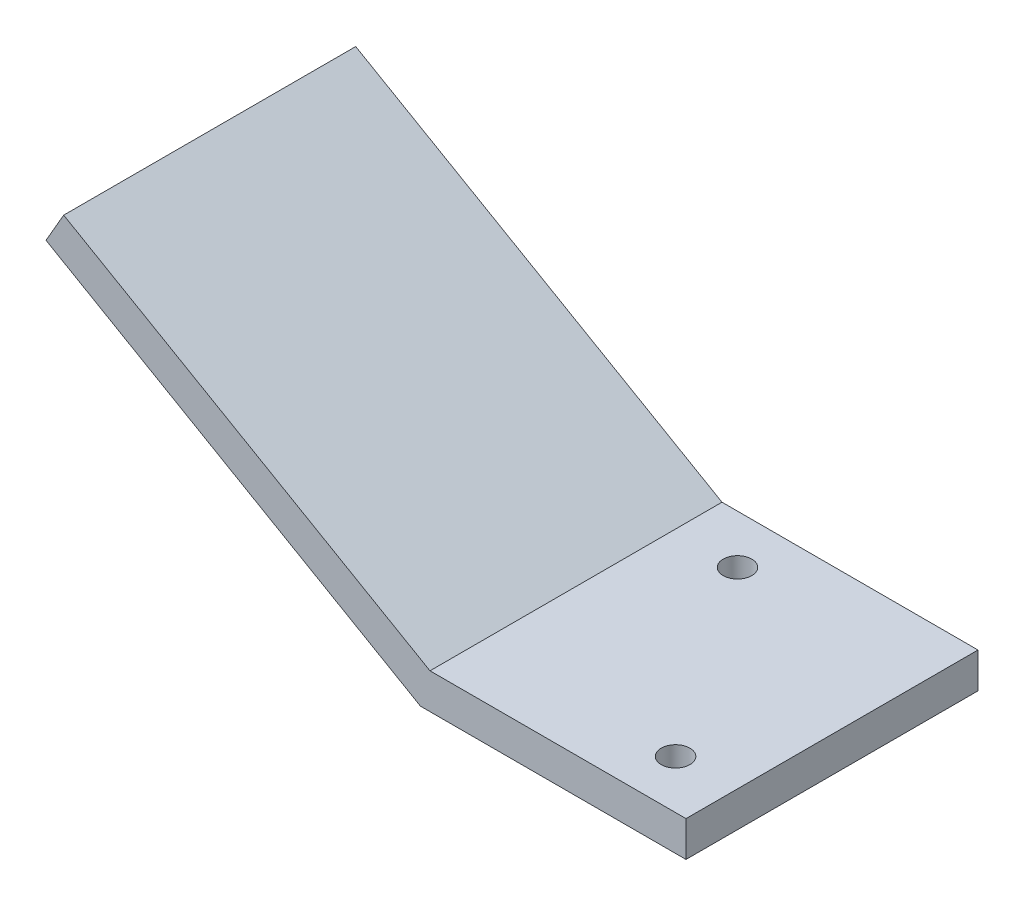
ISO-10303-21;
HEADER;
FILE_DESCRIPTION(('STEP AP214'),'2;1');
FILE_NAME('part.step','',(''),(''),'','','');
FILE_SCHEMA(('AUTOMOTIVE_DESIGN { 1 0 10303 214 1 1 1 1 }'));
ENDSEC;
DATA;
#1=APPLICATION_CONTEXT('core data for automotive mechanical design processes');
#2=APPLICATION_PROTOCOL_DEFINITION('international standard','automotive_design',2000,#1);
#3=PRODUCT_CONTEXT('',#1,'mechanical');
#4=PRODUCT('Part','Part','',(#3));
#5=PRODUCT_RELATED_PRODUCT_CATEGORY('part','',(#4));
#6=PRODUCT_DEFINITION_FORMATION('','',#4);
#7=PRODUCT_DEFINITION_CONTEXT('part definition',#1,'design');
#8=PRODUCT_DEFINITION('design','',#6,#7);
#9=PRODUCT_DEFINITION_SHAPE('','',#8);
#10=(LENGTH_UNIT() NAMED_UNIT(*) SI_UNIT(.MILLI.,.METRE.));
#11=(NAMED_UNIT(*) PLANE_ANGLE_UNIT() SI_UNIT($,.RADIAN.));
#12=(NAMED_UNIT(*) SI_UNIT($,.STERADIAN.) SOLID_ANGLE_UNIT());
#13=UNCERTAINTY_MEASURE_WITH_UNIT(LENGTH_MEASURE(1.E-05),#10,'distance_accuracy_value','');
#14=(GEOMETRIC_REPRESENTATION_CONTEXT(3) GLOBAL_UNCERTAINTY_ASSIGNED_CONTEXT((#13)) GLOBAL_UNIT_ASSIGNED_CONTEXT((#10,
#11,#12)) REPRESENTATION_CONTEXT('',''));
#15=CARTESIAN_POINT('',(0.,0.,0.));
#16=DIRECTION('',(0.,0.,1.));
#17=DIRECTION('',(1.,0.,0.));
#18=AXIS2_PLACEMENT_3D('',#15,#16,#17);
#19=CARTESIAN_POINT('',(-13.6602540378444,-3.66025403784447,0.));
#20=DIRECTION('',(0.,0.,-1.));
#21=DIRECTION('',(-1.,0.,0.));
#22=AXIS2_PLACEMENT_3D('',#19,#20,#21);
#23=PLANE('',#22);
#24=DIRECTION('',(-0.866025403784442,0.499999999999995,0.));
#25=VECTOR('',#24,1.);
#26=CARTESIAN_POINT('',(-11.6602540378444,-0.196152422706703,0.));
#27=LINE('',#26,#25);
#28=CARTESIAN_POINT('',(-11.6602540378444,-0.196152422706704,0.));
#29=VERTEX_POINT('',#28);
#30=CARTESIAN_POINT('',(-37.6410161513776,14.8038475772931,0.));
#31=VERTEX_POINT('',#30);
#32=EDGE_CURVE('E204',#29,#31,#27,.T.);
#33=ORIENTED_EDGE('',*,*,#32,.F.);
#34=DIRECTION('',(0.499999999999995,0.866025403784442,0.));
#35=VECTOR('',#34,1.);
#36=CARTESIAN_POINT('',(-13.6602540378444,-3.66025403784447,0.));
#37=LINE('',#36,#35);
#38=CARTESIAN_POINT('',(-8.66025403784442,4.99999999999995,0.));
#39=VERTEX_POINT('',#38);
#40=EDGE_CURVE('E211',#29,#39,#37,.T.);
#41=ORIENTED_EDGE('',*,*,#40,.T.);
#42=DIRECTION('',(-0.866025403784442,0.499999999999995,0.));
#43=VECTOR('',#42,1.);
#44=CARTESIAN_POINT('',(-8.66025403784442,4.99999999999995,0.));
#45=LINE('',#44,#43);
#46=CARTESIAN_POINT('',(-34.6410161513777,19.9999999999998,0.));
#47=VERTEX_POINT('',#46);
#48=EDGE_CURVE('E206',#39,#47,#45,.T.);
#49=ORIENTED_EDGE('',*,*,#48,.T.);
#50=DIRECTION('',(0.499999999999995,0.866025403784442,0.));
#51=VECTOR('',#50,1.);
#52=CARTESIAN_POINT('',(-39.6410161513776,11.3397459621554,0.));
#53=LINE('',#52,#51);
#54=EDGE_CURVE('E224',#31,#47,#53,.T.);
#55=ORIENTED_EDGE('',*,*,#54,.F.);
#56=EDGE_LOOP('',(#33,#41,#49,#55));
#57=FACE_BOUND('',#56,.T.);
#58=ADVANCED_FACE('F58',(#57),#23,.F.);
#59=CARTESIAN_POINT('',(-13.6602540378444,-3.66025403784447,-9.99999999999999));
#60=DIRECTION('',(0.,0.,1.));
#61=DIRECTION('',(1.,0.,0.));
#62=AXIS2_PLACEMENT_3D('',#59,#60,#61);
#63=PLANE('',#62);
#64=DIRECTION('',(0.866025403784442,-0.499999999999995,0.));
#65=VECTOR('',#64,1.);
#66=CARTESIAN_POINT('',(-11.6602540378444,-0.196152422706703,-9.99999999999999));
#67=LINE('',#66,#65);
#68=CARTESIAN_POINT('',(-37.6410161513776,14.8038475772931,-9.99999999999999));
#69=VERTEX_POINT('',#68);
#70=CARTESIAN_POINT('',(-11.6602540378444,-0.196152422706704,-9.99999999999999));
#71=VERTEX_POINT('',#70);
#72=EDGE_CURVE('E178',#69,#71,#67,.T.);
#73=ORIENTED_EDGE('',*,*,#72,.F.);
#74=DIRECTION('',(0.499999999999995,0.866025403784442,0.));
#75=VECTOR('',#74,1.);
#76=CARTESIAN_POINT('',(-39.6410161513776,11.3397459621554,-9.99999999999999));
#77=LINE('',#76,#75);
#78=CARTESIAN_POINT('',(-34.6410161513777,19.9999999999998,-9.99999999999999));
#79=VERTEX_POINT('',#78);
#80=EDGE_CURVE('E222',#69,#79,#77,.T.);
#81=ORIENTED_EDGE('',*,*,#80,.T.);
#82=DIRECTION('',(0.866025403784442,-0.499999999999995,0.));
#83=VECTOR('',#82,1.);
#84=CARTESIAN_POINT('',(-8.66025403784442,4.99999999999995,-9.99999999999999));
#85=LINE('',#84,#83);
#86=CARTESIAN_POINT('',(-8.66025403784442,4.99999999999995,-9.99999999999999));
#87=VERTEX_POINT('',#86);
#88=EDGE_CURVE('E217',#79,#87,#85,.T.);
#89=ORIENTED_EDGE('',*,*,#88,.T.);
#90=DIRECTION('',(0.499999999999995,0.866025403784442,0.));
#91=VECTOR('',#90,1.);
#92=CARTESIAN_POINT('',(-13.6602540378444,-3.66025403784447,-9.99999999999999));
#93=LINE('',#92,#91);
#94=EDGE_CURVE('E75',#71,#87,#93,.T.);
#95=ORIENTED_EDGE('',*,*,#94,.F.);
#96=EDGE_LOOP('',(#73,#81,#89,#95));
#97=FACE_BOUND('',#96,.T.);
#98=ADVANCED_FACE('F314',(#97),#63,.F.);
#99=CARTESIAN_POINT('',(0.,0.,-18.5));
#100=DIRECTION('',(-0.499999999999995,-0.866025403784442,0.));
#101=DIRECTION('',(0.866025403784442,-0.499999999999995,0.));
#102=AXIS2_PLACEMENT_3D('',#99,#100,#101);
#103=PLANE('',#102);
#104=DIRECTION('',(0.,0.,1.));
#105=VECTOR('',#104,1.);
#106=CARTESIAN_POINT('',(-42.3205080756888,24.4337567297404,11.5));
#107=LINE('',#106,#105);
#108=CARTESIAN_POINT('',(-42.3205080756888,24.4337567297404,-21.5));
#109=VERTEX_POINT('',#108);
#110=CARTESIAN_POINT('',(-42.3205080756888,24.4337567297404,11.5));
#111=VERTEX_POINT('',#110);
#112=EDGE_CURVE('E259',#109,#111,#107,.T.);
#113=ORIENTED_EDGE('',*,*,#112,.F.);
#114=DIRECTION('',(-0.866025403784441,0.499999999999996,0.));
#115=VECTOR('',#114,1.);
#116=CARTESIAN_POINT('',(-42.3205080756888,24.4337567297404,-21.5));
#117=LINE('',#116,#115);
#118=CARTESIAN_POINT('',(0.,0.,-21.5));
#119=VERTEX_POINT('',#118);
#120=EDGE_CURVE('E248',#119,#109,#117,.T.);
#121=ORIENTED_EDGE('',*,*,#120,.F.);
#122=DIRECTION('',(0.,0.,1.));
#123=VECTOR('',#122,1.);
#124=CARTESIAN_POINT('',(0.,0.,0.));
#125=LINE('',#124,#123);
#126=CARTESIAN_POINT('',(0.,0.,11.5));
#127=VERTEX_POINT('',#126);
#128=EDGE_CURVE('E12',#119,#127,#125,.T.);
#129=ORIENTED_EDGE('',*,*,#128,.T.);
#130=DIRECTION('',(0.866025403784442,-0.499999999999995,0.));
#131=VECTOR('',#130,1.);
#132=CARTESIAN_POINT('',(0.,0.,11.5));
#133=LINE('',#132,#131);
#134=EDGE_CURVE('E267',#111,#127,#133,.T.);
#135=ORIENTED_EDGE('',*,*,#134,.F.);
#136=EDGE_LOOP('',(#113,#121,#129,#135));
#137=FACE_BOUND('',#136,.T.);
#138=DIRECTION('',(0.,0.,-1.));
#139=VECTOR('',#138,1.);
#140=CARTESIAN_POINT('',(-34.6410161513777,19.9999999999998,0.));
#141=LINE('',#140,#139);
#142=EDGE_CURVE('E214',#47,#79,#141,.T.);
#143=ORIENTED_EDGE('',*,*,#142,.F.);
#144=ORIENTED_EDGE('',*,*,#48,.F.);
#145=DIRECTION('',(0.,0.,1.));
#146=VECTOR('',#145,1.);
#147=CARTESIAN_POINT('',(-8.66025403784442,4.99999999999995,-9.99999999999999));
#148=LINE('',#147,#146);
#149=EDGE_CURVE('E209',#87,#39,#148,.T.);
#150=ORIENTED_EDGE('',*,*,#149,.F.);
#151=ORIENTED_EDGE('',*,*,#88,.F.);
#152=EDGE_LOOP('',(#143,#144,#150,#151));
#153=FACE_BOUND('',#152,.T.);
#154=ADVANCED_FACE('F311',(#137,#153),#103,.T.);
#155=CARTESIAN_POINT('',(-25.,20.,11.5));
#156=DIRECTION('',(0.,0.,-1.));
#157=DIRECTION('',(-1.,0.,0.));
#158=AXIS2_PLACEMENT_3D('',#155,#156,#157);
#159=PLANE('',#158);
#160=DIRECTION('',(-0.866025403784438,0.500000000000001,0.));
#161=VECTOR('',#160,1.);
#162=CARTESIAN_POINT('',(1.99999999999989,3.46410161513756,11.5));
#163=LINE('',#162,#161);
#164=CARTESIAN_POINT('',(1.07179676972404,4.,11.5));
#165=VERTEX_POINT('',#164);
#166=CARTESIAN_POINT('',(-40.3205080756889,27.897858344878,11.5));
#167=VERTEX_POINT('',#166);
#168=EDGE_CURVE('E83',#165,#167,#163,.T.);
#169=ORIENTED_EDGE('',*,*,#168,.T.);
#170=DIRECTION('',(0.499999999999997,0.866025403784441,0.));
#171=VECTOR('',#170,1.);
#172=CARTESIAN_POINT('',(-40.3205080756889,27.897858344878,11.5));
#173=LINE('',#172,#171);
#174=EDGE_CURVE('E262',#111,#167,#173,.T.);
#175=ORIENTED_EDGE('',*,*,#174,.F.);
#176=ORIENTED_EDGE('',*,*,#134,.T.);
#177=DIRECTION('',(1.,0.,0.));
#178=VECTOR('',#177,1.);
#179=CARTESIAN_POINT('',(-25.,0.,11.5));
#180=LINE('',#179,#178);
#181=CARTESIAN_POINT('',(30.,0.,11.5));
#182=VERTEX_POINT('',#181);
#183=EDGE_CURVE('E67',#127,#182,#180,.T.);
#184=ORIENTED_EDGE('',*,*,#183,.T.);
#185=DIRECTION('',(0.,-1.,0.));
#186=VECTOR('',#185,1.);
#187=CARTESIAN_POINT('',(30.,0.,11.5));
#188=LINE('',#187,#186);
#189=CARTESIAN_POINT('',(30.,4.,11.5));
#190=VERTEX_POINT('',#189);
#191=EDGE_CURVE('E233',#190,#182,#188,.T.);
#192=ORIENTED_EDGE('',*,*,#191,.F.);
#193=DIRECTION('',(-1.,0.,0.));
#194=VECTOR('',#193,1.);
#195=CARTESIAN_POINT('',(0.,4.,11.5));
#196=LINE('',#195,#194);
#197=EDGE_CURVE('E271',#190,#165,#196,.T.);
#198=ORIENTED_EDGE('',*,*,#197,.T.);
#199=EDGE_LOOP('',(#169,#175,#176,#184,#192,#198));
#200=FACE_BOUND('',#199,.T.);
#201=ADVANCED_FACE('F60',(#200),#159,.F.);
#202=CARTESIAN_POINT('',(0.,0.,0.));
#203=DIRECTION('',(0.,1.,0.));
#204=DIRECTION('',(0.,0.,1.));
#205=AXIS2_PLACEMENT_3D('',#202,#203,#204);
#206=PLANE('',#205);
#207=CARTESIAN_POINT('',(23.3222354943985,0.,6.));
#208=DIRECTION('',(0.,-1.,0.));
#209=DIRECTION('',(0.,0.,-1.));
#210=AXIS2_PLACEMENT_3D('',#207,#208,#209);
#211=CIRCLE('',#210,1.62);
#212=CARTESIAN_POINT('',(23.3222354943985,0.,4.38));
#213=VERTEX_POINT('',#212);
#214=EDGE_CURVE('E227',#213,#213,#211,.T.);
#215=ORIENTED_EDGE('',*,*,#214,.F.);
#216=EDGE_LOOP('',(#215));
#217=FACE_BOUND('',#216,.T.);
#218=CARTESIAN_POINT('',(8.3222354943985,0.,-16.));
#219=DIRECTION('',(0.,-1.,0.));
#220=DIRECTION('',(0.,0.,-1.));
#221=AXIS2_PLACEMENT_3D('',#218,#219,#220);
#222=CIRCLE('',#221,1.62);
#223=CARTESIAN_POINT('',(8.3222354943985,0.,-17.62));
#224=VERTEX_POINT('',#223);
#225=EDGE_CURVE('E226',#224,#224,#222,.T.);
#226=ORIENTED_EDGE('',*,*,#225,.F.);
#227=EDGE_LOOP('',(#226));
#228=FACE_BOUND('',#227,.T.);
#229=ORIENTED_EDGE('',*,*,#128,.F.);
#230=DIRECTION('',(-1.,0.,0.));
#231=VECTOR('',#230,1.);
#232=CARTESIAN_POINT('',(0.,0.,-21.5));
#233=LINE('',#232,#231);
#234=CARTESIAN_POINT('',(30.,0.,-21.5));
#235=VERTEX_POINT('',#234);
#236=EDGE_CURVE('E245',#235,#119,#233,.T.);
#237=ORIENTED_EDGE('',*,*,#236,.F.);
#238=DIRECTION('',(0.,0.,-1.));
#239=VECTOR('',#238,1.);
#240=CARTESIAN_POINT('',(30.,0.,-21.5));
#241=LINE('',#240,#239);
#242=EDGE_CURVE('E236',#182,#235,#241,.T.);
#243=ORIENTED_EDGE('',*,*,#242,.F.);
#244=ORIENTED_EDGE('',*,*,#183,.F.);
#245=EDGE_LOOP('',(#229,#237,#243,#244));
#246=FACE_BOUND('',#245,.T.);
#247=ADVANCED_FACE('F303',(#217,#228,#246),#206,.F.);
#248=CARTESIAN_POINT('',(1.99999999999989,3.46410161513756,-18.5));
#249=DIRECTION('',(0.500000000000001,0.866025403784438,0.));
#250=DIRECTION('',(-0.866025403784438,0.500000000000001,0.));
#251=AXIS2_PLACEMENT_3D('',#248,#249,#250);
#252=PLANE('',#251);
#253=DIRECTION('',(0.,0.,1.));
#254=VECTOR('',#253,1.);
#255=CARTESIAN_POINT('',(1.07179676972404,4.,-18.5));
#256=LINE('',#255,#254);
#257=CARTESIAN_POINT('',(1.07179676972404,4.,-21.5));
#258=VERTEX_POINT('',#257);
#259=EDGE_CURVE('E274',#258,#165,#256,.T.);
#260=ORIENTED_EDGE('',*,*,#259,.F.);
#261=DIRECTION('',(0.866025403784439,-0.499999999999999,0.));
#262=VECTOR('',#261,1.);
#263=CARTESIAN_POINT('',(1.07179676972404,4.,-21.5));
#264=LINE('',#263,#262);
#265=CARTESIAN_POINT('',(-40.3205080756888,27.8978583448781,-21.5));
#266=VERTEX_POINT('',#265);
#267=EDGE_CURVE('E254',#266,#258,#264,.T.);
#268=ORIENTED_EDGE('',*,*,#267,.F.);
#269=DIRECTION('',(0.,0.,-1.));
#270=VECTOR('',#269,1.);
#271=CARTESIAN_POINT('',(-40.3205080756888,27.8978583448781,-11.5));
#272=LINE('',#271,#270);
#273=EDGE_CURVE('E265',#167,#266,#272,.T.);
#274=ORIENTED_EDGE('',*,*,#273,.F.);
#275=ORIENTED_EDGE('',*,*,#168,.F.);
#276=EDGE_LOOP('',(#260,#268,#274,#275));
#277=FACE_BOUND('',#276,.T.);
#278=ADVANCED_FACE('F289',(#277),#252,.T.);
#279=CARTESIAN_POINT('',(0.,4.,-18.5));
#280=DIRECTION('',(0.,1.,0.));
#281=DIRECTION('',(0.,0.,1.));
#282=AXIS2_PLACEMENT_3D('',#279,#280,#281);
#283=PLANE('',#282);
#284=CARTESIAN_POINT('',(23.3222354943985,4.,6.));
#285=DIRECTION('',(0.,1.,0.));
#286=DIRECTION('',(0.,0.,1.));
#287=AXIS2_PLACEMENT_3D('',#284,#285,#286);
#288=CIRCLE('',#287,1.62);
#289=CARTESIAN_POINT('',(23.3222354943985,4.,7.62));
#290=VERTEX_POINT('',#289);
#291=EDGE_CURVE('E62',#290,#290,#288,.T.);
#292=ORIENTED_EDGE('',*,*,#291,.F.);
#293=EDGE_LOOP('',(#292));
#294=FACE_BOUND('',#293,.T.);
#295=CARTESIAN_POINT('',(8.3222354943985,4.,-16.));
#296=DIRECTION('',(0.,1.,0.));
#297=DIRECTION('',(0.,0.,1.));
#298=AXIS2_PLACEMENT_3D('',#295,#296,#297);
#299=CIRCLE('',#298,1.62);
#300=CARTESIAN_POINT('',(8.3222354943985,4.,-14.38));
#301=VERTEX_POINT('',#300);
#302=EDGE_CURVE('E230',#301,#301,#299,.T.);
#303=ORIENTED_EDGE('',*,*,#302,.F.);
#304=EDGE_LOOP('',(#303));
#305=FACE_BOUND('',#304,.T.);
#306=ORIENTED_EDGE('',*,*,#197,.F.);
#307=DIRECTION('',(0.,0.,1.));
#308=VECTOR('',#307,1.);
#309=CARTESIAN_POINT('',(30.,4.,11.5));
#310=LINE('',#309,#308);
#311=CARTESIAN_POINT('',(30.,4.,-21.5));
#312=VERTEX_POINT('',#311);
#313=EDGE_CURVE('E242',#312,#190,#310,.T.);
#314=ORIENTED_EDGE('',*,*,#313,.F.);
#315=DIRECTION('',(1.,0.,0.));
#316=VECTOR('',#315,1.);
#317=CARTESIAN_POINT('',(25.,4.,-21.5));
#318=LINE('',#317,#316);
#319=EDGE_CURVE('E257',#258,#312,#318,.T.);
#320=ORIENTED_EDGE('',*,*,#319,.F.);
#321=ORIENTED_EDGE('',*,*,#259,.T.);
#322=EDGE_LOOP('',(#306,#314,#320,#321));
#323=FACE_BOUND('',#322,.T.);
#324=ADVANCED_FACE('F285',(#294,#305,#323),#283,.T.);
#325=CARTESIAN_POINT('',(-42.3205080756888,24.4337567297404,0.));
#326=DIRECTION('',(0.86602540378444,-0.499999999999997,0.));
#327=DIRECTION('',(0.499999999999997,0.86602540378444,0.));
#328=AXIS2_PLACEMENT_3D('',#325,#326,#327);
#329=PLANE('',#328);
#330=ORIENTED_EDGE('',*,*,#273,.T.);
#331=DIRECTION('',(0.499999999999997,0.86602540378444,0.));
#332=VECTOR('',#331,1.);
#333=CARTESIAN_POINT('',(-40.3205080756888,27.8978583448781,-21.5));
#334=LINE('',#333,#332);
#335=EDGE_CURVE('E251',#109,#266,#334,.T.);
#336=ORIENTED_EDGE('',*,*,#335,.F.);
#337=ORIENTED_EDGE('',*,*,#112,.T.);
#338=ORIENTED_EDGE('',*,*,#174,.T.);
#339=EDGE_LOOP('',(#330,#336,#337,#338));
#340=FACE_BOUND('',#339,.T.);
#341=ADVANCED_FACE('F288',(#340),#329,.F.);
#342=CARTESIAN_POINT('',(0.,0.,-21.5));
#343=DIRECTION('',(0.,0.,1.));
#344=DIRECTION('',(1.,0.,0.));
#345=AXIS2_PLACEMENT_3D('',#342,#343,#344);
#346=PLANE('',#345);
#347=ORIENTED_EDGE('',*,*,#319,.T.);
#348=DIRECTION('',(0.,1.,0.));
#349=VECTOR('',#348,1.);
#350=CARTESIAN_POINT('',(30.,4.,-21.5));
#351=LINE('',#350,#349);
#352=EDGE_CURVE('E239',#235,#312,#351,.T.);
#353=ORIENTED_EDGE('',*,*,#352,.F.);
#354=ORIENTED_EDGE('',*,*,#236,.T.);
#355=ORIENTED_EDGE('',*,*,#120,.T.);
#356=ORIENTED_EDGE('',*,*,#335,.T.);
#357=ORIENTED_EDGE('',*,*,#267,.T.);
#358=EDGE_LOOP('',(#347,#353,#354,#355,#356,#357));
#359=FACE_BOUND('',#358,.T.);
#360=ADVANCED_FACE('F305',(#359),#346,.F.);
#361=CARTESIAN_POINT('',(30.,0.,0.));
#362=DIRECTION('',(-1.,0.,0.));
#363=DIRECTION('',(0.,0.,1.));
#364=AXIS2_PLACEMENT_3D('',#361,#362,#363);
#365=PLANE('',#364);
#366=ORIENTED_EDGE('',*,*,#191,.T.);
#367=ORIENTED_EDGE('',*,*,#242,.T.);
#368=ORIENTED_EDGE('',*,*,#352,.T.);
#369=ORIENTED_EDGE('',*,*,#313,.T.);
#370=EDGE_LOOP('',(#366,#367,#368,#369));
#371=FACE_BOUND('',#370,.T.);
#372=ADVANCED_FACE('F297',(#371),#365,.F.);
#373=CARTESIAN_POINT('',(8.3222354943985,5.,-16.));
#374=DIRECTION('',(0.,-1.,0.));
#375=DIRECTION('',(0.,0.,-1.));
#376=AXIS2_PLACEMENT_3D('',#373,#374,#375);
#377=CYLINDRICAL_SURFACE('',#376,1.62);
#378=ORIENTED_EDGE('',*,*,#302,.T.);
#379=EDGE_LOOP('',(#378));
#380=FACE_BOUND('',#379,.T.);
#381=ORIENTED_EDGE('',*,*,#225,.T.);
#382=EDGE_LOOP('',(#381));
#383=FACE_BOUND('',#382,.T.);
#384=ADVANCED_FACE('F353',(#380,#383),#377,.F.);
#385=CARTESIAN_POINT('',(23.3222354943985,5.,6.));
#386=DIRECTION('',(0.,-1.,0.));
#387=DIRECTION('',(0.,0.,-1.));
#388=AXIS2_PLACEMENT_3D('',#385,#386,#387);
#389=CYLINDRICAL_SURFACE('',#388,1.62);
#390=ORIENTED_EDGE('',*,*,#291,.T.);
#391=EDGE_LOOP('',(#390));
#392=FACE_BOUND('',#391,.T.);
#393=ORIENTED_EDGE('',*,*,#214,.T.);
#394=EDGE_LOOP('',(#393));
#395=FACE_BOUND('',#394,.T.);
#396=ADVANCED_FACE('F282',(#392,#395),#389,.F.);
#397=CARTESIAN_POINT('',(-39.6410161513776,11.3397459621554,0.));
#398=DIRECTION('',(0.866025403784442,-0.499999999999995,0.));
#399=DIRECTION('',(0.499999999999995,0.866025403784442,0.));
#400=AXIS2_PLACEMENT_3D('',#397,#398,#399);
#401=PLANE('',#400);
#402=DIRECTION('',(0.,0.,-1.));
#403=VECTOR('',#402,1.);
#404=CARTESIAN_POINT('',(-39.6410161513776,11.3397459621554,0.));
#405=LINE('',#404,#403);
#406=CARTESIAN_POINT('',(-39.6410161513776,11.3397459621554,4.));
#407=VERTEX_POINT('',#406);
#408=CARTESIAN_POINT('',(-39.6410161513776,11.3397459621554,-14.));
#409=VERTEX_POINT('',#408);
#410=EDGE_CURVE('E207',#407,#409,#405,.T.);
#411=ORIENTED_EDGE('',*,*,#410,.F.);
#412=DIRECTION('',(-0.499999999999995,-0.866025403784442,0.));
#413=VECTOR('',#412,1.);
#414=CARTESIAN_POINT('',(-37.6410161513776,14.8038475772931,4.));
#415=LINE('',#414,#413);
#416=CARTESIAN_POINT('',(-37.6410161513776,14.8038475772931,4.));
#417=VERTEX_POINT('',#416);
#418=EDGE_CURVE('E199',#417,#407,#415,.T.);
#419=ORIENTED_EDGE('',*,*,#418,.F.);
#420=DIRECTION('',(0.,0.,-1.));
#421=VECTOR('',#420,1.);
#422=CARTESIAN_POINT('',(-37.6410161513776,14.8038475772931,4.));
#423=LINE('',#422,#421);
#424=EDGE_CURVE('E171',#417,#31,#423,.T.);
#425=ORIENTED_EDGE('',*,*,#424,.T.);
#426=ORIENTED_EDGE('',*,*,#54,.T.);
#427=ORIENTED_EDGE('',*,*,#142,.T.);
#428=ORIENTED_EDGE('',*,*,#80,.F.);
#429=CARTESIAN_POINT('',(-37.6410161513776,14.8038475772931,-14.));
#430=VERTEX_POINT('',#429);
#431=EDGE_CURVE('E194',#69,#430,#423,.T.);
#432=ORIENTED_EDGE('',*,*,#431,.T.);
#433=DIRECTION('',(-0.499999999999995,-0.866025403784442,0.));
#434=VECTOR('',#433,1.);
#435=CARTESIAN_POINT('',(-37.6410161513776,14.8038475772931,-14.));
#436=LINE('',#435,#434);
#437=EDGE_CURVE('E185',#430,#409,#436,.T.);
#438=ORIENTED_EDGE('',*,*,#437,.T.);
#439=EDGE_LOOP('',(#411,#419,#425,#426,#427,#428,#432,#438));
#440=FACE_BOUND('',#439,.T.);
#441=ADVANCED_FACE('F322',(#440),#401,.F.);
#442=CARTESIAN_POINT('',(-13.6602540378444,-3.66025403784447,-9.99999999999999));
#443=DIRECTION('',(-0.866025403784442,0.499999999999995,0.));
#444=DIRECTION('',(-0.499999999999995,-0.866025403784442,0.));
#445=AXIS2_PLACEMENT_3D('',#442,#443,#444);
#446=PLANE('',#445);
#447=DIRECTION('',(0.,0.,1.));
#448=VECTOR('',#447,1.);
#449=CARTESIAN_POINT('',(-13.6602540378444,-3.66025403784447,-9.99999999999999));
#450=LINE('',#449,#448);
#451=CARTESIAN_POINT('',(-13.6602540378444,-3.66025403784447,-14.));
#452=VERTEX_POINT('',#451);
#453=CARTESIAN_POINT('',(-13.6602540378444,-3.66025403784447,4.));
#454=VERTEX_POINT('',#453);
#455=EDGE_CURVE('E165',#452,#454,#450,.T.);
#456=ORIENTED_EDGE('',*,*,#455,.F.);
#457=DIRECTION('',(-0.499999999999995,-0.866025403784442,0.));
#458=VECTOR('',#457,1.);
#459=CARTESIAN_POINT('',(-11.6602540378444,-0.196152422706704,-14.));
#460=LINE('',#459,#458);
#461=CARTESIAN_POINT('',(-11.6602540378444,-0.196152422706704,-14.));
#462=VERTEX_POINT('',#461);
#463=EDGE_CURVE('E160',#462,#452,#460,.T.);
#464=ORIENTED_EDGE('',*,*,#463,.F.);
#465=DIRECTION('',(0.,0.,1.));
#466=VECTOR('',#465,1.);
#467=CARTESIAN_POINT('',(-11.6602540378444,-0.196152422706704,-14.));
#468=LINE('',#467,#466);
#469=EDGE_CURVE('E163',#462,#71,#468,.T.);
#470=ORIENTED_EDGE('',*,*,#469,.T.);
#471=ORIENTED_EDGE('',*,*,#94,.T.);
#472=ORIENTED_EDGE('',*,*,#149,.T.);
#473=ORIENTED_EDGE('',*,*,#40,.F.);
#474=CARTESIAN_POINT('',(-11.6602540378444,-0.196152422706704,4.));
#475=VERTEX_POINT('',#474);
#476=EDGE_CURVE('E180',#29,#475,#468,.T.);
#477=ORIENTED_EDGE('',*,*,#476,.T.);
#478=DIRECTION('',(-0.499999999999995,-0.866025403784442,0.));
#479=VECTOR('',#478,1.);
#480=CARTESIAN_POINT('',(-11.6602540378444,-0.196152422706704,4.));
#481=LINE('',#480,#479);
#482=EDGE_CURVE('E170',#475,#454,#481,.T.);
#483=ORIENTED_EDGE('',*,*,#482,.T.);
#484=EDGE_LOOP('',(#456,#464,#470,#471,#472,#473,#477,#483));
#485=FACE_BOUND('',#484,.T.);
#486=ADVANCED_FACE('F162',(#485),#446,.F.);
#487=CARTESIAN_POINT('',(-4.99999999999995,-8.66025403784442,0.));
#488=DIRECTION('',(-0.499999999999995,-0.866025403784442,0.));
#489=DIRECTION('',(0.866025403784442,-0.499999999999995,0.));
#490=AXIS2_PLACEMENT_3D('',#487,#488,#489);
#491=PLANE('',#490);
#492=ORIENTED_EDGE('',*,*,#455,.T.);
#493=DIRECTION('',(-0.866025403784442,0.499999999999995,0.));
#494=VECTOR('',#493,1.);
#495=CARTESIAN_POINT('',(-13.6602540378444,-3.66025403784447,4.));
#496=LINE('',#495,#494);
#497=EDGE_CURVE('E186',#454,#407,#496,.T.);
#498=ORIENTED_EDGE('',*,*,#497,.T.);
#499=ORIENTED_EDGE('',*,*,#410,.T.);
#500=DIRECTION('',(0.866025403784442,-0.499999999999995,0.));
#501=VECTOR('',#500,1.);
#502=CARTESIAN_POINT('',(-13.6602540378444,-3.66025403784447,-14.));
#503=LINE('',#502,#501);
#504=EDGE_CURVE('E189',#409,#452,#503,.T.);
#505=ORIENTED_EDGE('',*,*,#504,.T.);
#506=EDGE_LOOP('',(#492,#498,#499,#505));
#507=FACE_BOUND('',#506,.T.);
#508=ADVANCED_FACE('F405',(#507),#491,.T.);
#509=CARTESIAN_POINT('',(-11.6602540378444,-0.196152422706704,-14.));
#510=DIRECTION('',(0.,0.,-1.));
#511=DIRECTION('',(-1.,0.,0.));
#512=AXIS2_PLACEMENT_3D('',#509,#510,#511);
#513=PLANE('',#512);
#514=ORIENTED_EDGE('',*,*,#504,.F.);
#515=ORIENTED_EDGE('',*,*,#437,.F.);
#516=DIRECTION('',(0.866025403784442,-0.499999999999995,0.));
#517=VECTOR('',#516,1.);
#518=CARTESIAN_POINT('',(-11.6602540378444,-0.196152422706704,-14.));
#519=LINE('',#518,#517);
#520=EDGE_CURVE('E176',#430,#462,#519,.T.);
#521=ORIENTED_EDGE('',*,*,#520,.T.);
#522=ORIENTED_EDGE('',*,*,#463,.T.);
#523=EDGE_LOOP('',(#514,#515,#521,#522));
#524=FACE_BOUND('',#523,.T.);
#525=ADVANCED_FACE('F183',(#524),#513,.T.);
#526=CARTESIAN_POINT('',(-2.99999999999997,-5.19615242270665,0.));
#527=DIRECTION('',(-0.499999999999995,-0.866025403784442,0.));
#528=DIRECTION('',(0.866025403784442,-0.499999999999995,0.));
#529=AXIS2_PLACEMENT_3D('',#526,#527,#528);
#530=PLANE('',#529);
#531=ORIENTED_EDGE('',*,*,#431,.F.);
#532=ORIENTED_EDGE('',*,*,#72,.T.);
#533=ORIENTED_EDGE('',*,*,#469,.F.);
#534=ORIENTED_EDGE('',*,*,#520,.F.);
#535=EDGE_LOOP('',(#531,#532,#533,#534));
#536=FACE_BOUND('',#535,.T.);
#537=ADVANCED_FACE('F175',(#536),#530,.F.);
#538=ORIENTED_EDGE('',*,*,#476,.F.);
#539=ORIENTED_EDGE('',*,*,#32,.T.);
#540=ORIENTED_EDGE('',*,*,#424,.F.);
#541=DIRECTION('',(-0.866025403784442,0.499999999999995,0.));
#542=VECTOR('',#541,1.);
#543=CARTESIAN_POINT('',(-11.6602540378444,-0.196152422706704,4.));
#544=LINE('',#543,#542);
#545=EDGE_CURVE('E179',#475,#417,#544,.T.);
#546=ORIENTED_EDGE('',*,*,#545,.F.);
#547=EDGE_LOOP('',(#538,#539,#540,#546));
#548=FACE_BOUND('',#547,.T.);
#549=ADVANCED_FACE('F334',(#548),#530,.F.);
#550=CARTESIAN_POINT('',(-11.6602540378444,-0.196152422706704,4.));
#551=DIRECTION('',(0.,0.,1.));
#552=DIRECTION('',(1.,0.,0.));
#553=AXIS2_PLACEMENT_3D('',#550,#551,#552);
#554=PLANE('',#553);
#555=ORIENTED_EDGE('',*,*,#497,.F.);
#556=ORIENTED_EDGE('',*,*,#482,.F.);
#557=ORIENTED_EDGE('',*,*,#545,.T.);
#558=ORIENTED_EDGE('',*,*,#418,.T.);
#559=EDGE_LOOP('',(#555,#556,#557,#558));
#560=FACE_BOUND('',#559,.T.);
#561=ADVANCED_FACE('F333',(#560),#554,.T.);
#562=CLOSED_SHELL('',(#58,#98,#154,#201,#247,#278,#324,#341,#360,#372,#384,#396,#441,#486,#508,
#525,#537,#549,#561));
#563=MANIFOLD_SOLID_BREP('B2',#562);
#564=ADVANCED_BREP_SHAPE_REPRESENTATION('',(#18,#563),#14);
#565=SHAPE_DEFINITION_REPRESENTATION(#9,#564);
ENDSEC;
END-ISO-10303-21;
